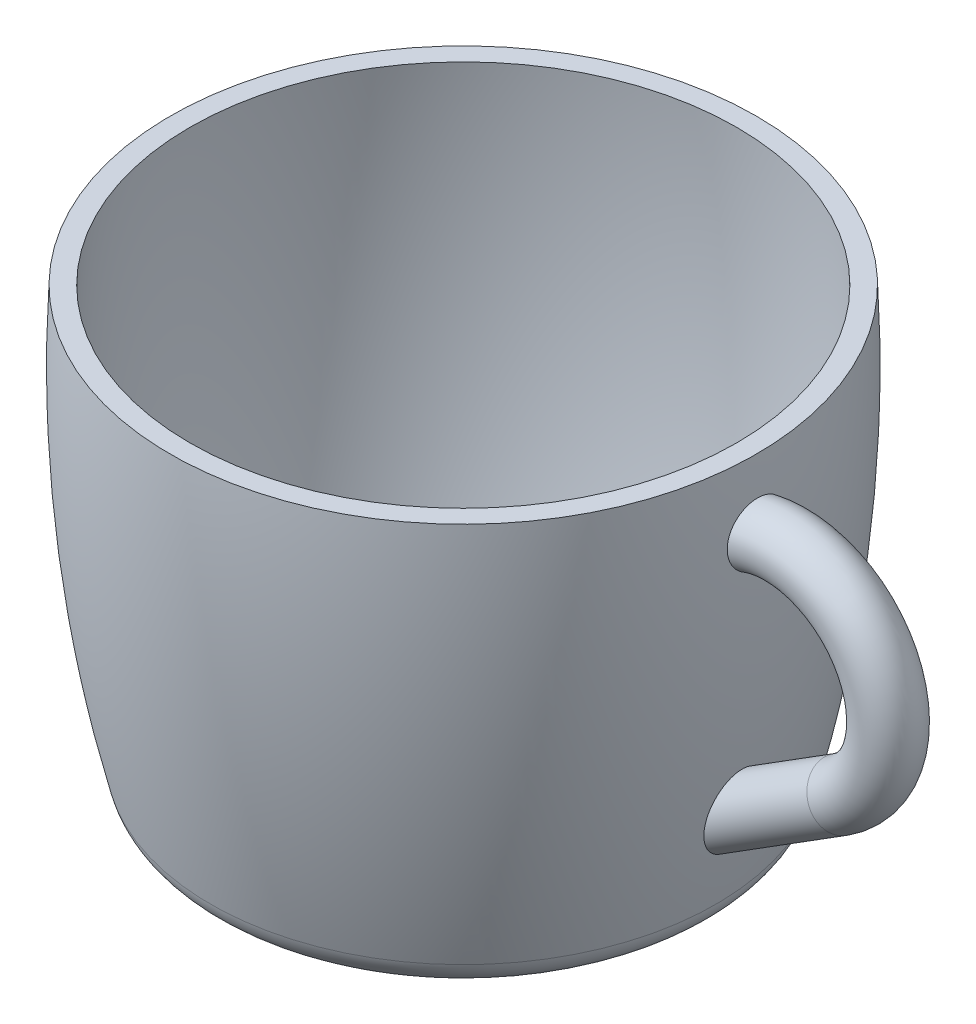
ISO-10303-21;
HEADER;
FILE_DESCRIPTION(('STEP AP214'),'2;1');
FILE_NAME('part.step','',(''),(''),'','','');
FILE_SCHEMA(('AUTOMOTIVE_DESIGN { 1 0 10303 214 1 1 1 1 }'));
ENDSEC;
DATA;
#1=APPLICATION_CONTEXT('core data for automotive mechanical design processes');
#2=APPLICATION_PROTOCOL_DEFINITION('international standard','automotive_design',2000,#1);
#3=PRODUCT_CONTEXT('',#1,'mechanical');
#4=PRODUCT('Part','Part','',(#3));
#5=PRODUCT_RELATED_PRODUCT_CATEGORY('part','',(#4));
#6=PRODUCT_DEFINITION_FORMATION('','',#4);
#7=PRODUCT_DEFINITION_CONTEXT('part definition',#1,'design');
#8=PRODUCT_DEFINITION('design','',#6,#7);
#9=PRODUCT_DEFINITION_SHAPE('','',#8);
#10=(LENGTH_UNIT() NAMED_UNIT(*) SI_UNIT(.MILLI.,.METRE.));
#11=(NAMED_UNIT(*) PLANE_ANGLE_UNIT() SI_UNIT($,.RADIAN.));
#12=(NAMED_UNIT(*) SI_UNIT($,.STERADIAN.) SOLID_ANGLE_UNIT());
#13=UNCERTAINTY_MEASURE_WITH_UNIT(LENGTH_MEASURE(1.E-05),#10,'distance_accuracy_value','');
#14=(GEOMETRIC_REPRESENTATION_CONTEXT(3) GLOBAL_UNCERTAINTY_ASSIGNED_CONTEXT((#13)) GLOBAL_UNIT_ASSIGNED_CONTEXT((#10,
#11,#12)) REPRESENTATION_CONTEXT('',''));
#15=CARTESIAN_POINT('',(0.,0.,0.));
#16=DIRECTION('',(0.,0.,1.));
#17=DIRECTION('',(1.,0.,0.));
#18=AXIS2_PLACEMENT_3D('',#15,#16,#17);
#19=CARTESIAN_POINT('',(0.,37.8307656430609,0.));
#20=DIRECTION('',(0.,-1.,0.));
#21=DIRECTION('',(0.,0.,-1.));
#22=AXIS2_PLACEMENT_3D('',#19,#20,#21);
#23=DEGENERATE_TOROIDAL_SURFACE('',#22,112.820173920687,141.,.F.);
#24=CARTESIAN_POINT('',(28.0939267680007,34.1727033823297,1.47013930084273));
#25=CARTESIAN_POINT('',(28.098052785009,34.0897917858126,1.35011754448564));
#26=CARTESIAN_POINT('',(28.1018780431306,34.0156310597502,1.22404886453937));
#27=CARTESIAN_POINT('',(28.1085712336181,33.88827607474,0.961668683807168));
#28=CARTESIAN_POINT('',(28.1114398524706,33.8350667760231,0.825364614389879));
#29=CARTESIAN_POINT('',(28.1159217040394,33.7526910965359,0.54469385159112));
#30=CARTESIAN_POINT('',(28.1175275539351,33.7236660518746,0.400284954708225));
#31=CARTESIAN_POINT('',(28.1192535818792,33.6924874031428,0.108583085184231));
#32=CARTESIAN_POINT('',(28.1193743576581,33.6903229878787,-0.0387087032054595));
#33=CARTESIAN_POINT('',(28.118162718884,33.7121854410131,-0.320590674050698));
#34=CARTESIAN_POINT('',(28.1169342198514,33.7343393449506,-0.455332332910221));
#35=CARTESIAN_POINT('',(28.1133229627621,33.800347507036,-0.719348492201702));
#36=CARTESIAN_POINT('',(28.1109398679948,33.844208095505,-0.848621385832717));
#37=CARTESIAN_POINT('',(28.1051746427437,33.95256341721,-1.10239452427035));
#38=CARTESIAN_POINT('',(28.1017664126068,34.0176014147798,-1.22665985435174));
#39=CARTESIAN_POINT('',(28.0942860185855,34.1647919716785,-1.46452181422794));
#40=CARTESIAN_POINT('',(28.0902135929775,34.2469512811505,-1.57811421047304));
#41=CARTESIAN_POINT('',(28.0810378576167,34.4398935670199,-1.81082533205163));
#42=CARTESIAN_POINT('',(28.0758742003077,34.5531557871295,-1.9278823600934));
#43=CARTESIAN_POINT('',(28.0655574744415,34.7949621418927,-2.14494266295726));
#44=CARTESIAN_POINT('',(28.0604044148207,34.9235160496807,-2.24493493098919));
#45=CARTESIAN_POINT('',(28.0496369057865,35.2175559450726,-2.44395286545056));
#46=CARTESIAN_POINT('',(28.0441128787931,35.3854788911991,-2.53939281982577));
#47=CARTESIAN_POINT('',(28.0343287997484,35.7336765425316,-2.70428507379648));
#48=CARTESIAN_POINT('',(28.0300694614008,35.9139581517581,-2.77372270521101));
#49=CARTESIAN_POINT('',(28.0229206613907,36.3049924770681,-2.89237098307851));
#50=CARTESIAN_POINT('',(28.020257639323,36.5168018053844,-2.93814338625935));
#51=CARTESIAN_POINT('',(28.0176464294867,36.9451195376369,-2.9945451591459));
#52=CARTESIAN_POINT('',(28.0176990094799,37.1616292531845,-3.00516458941149));
#53=CARTESIAN_POINT('',(28.0207347787654,37.598556610794,-2.98999756571531));
#54=CARTESIAN_POINT('',(28.0237871485375,37.8189457904785,-2.96334542102256));
#55=CARTESIAN_POINT('',(28.0327291726287,38.2515290372875,-2.87137363220633));
#56=CARTESIAN_POINT('',(28.0386183388775,38.4637245073572,-2.80606063923241));
#57=CARTESIAN_POINT('',(28.0522077666669,38.8610396900317,-2.6415823833145));
#58=CARTESIAN_POINT('',(28.0597915716997,39.047005172861,-2.54446039922764));
#59=CARTESIAN_POINT('',(28.0760092808761,39.3974587085022,-2.31707952503662));
#60=CARTESIAN_POINT('',(28.084642474135,39.561961146071,-2.18684300305985));
#61=CARTESIAN_POINT('',(28.1008920825619,39.8467511954677,-1.91078997665695));
#62=CARTESIAN_POINT('',(28.1085236447645,39.9698184112538,-1.7678454667739));
#63=CARTESIAN_POINT('',(28.1226649944415,40.1867048004043,-1.46120135185329));
#64=CARTESIAN_POINT('',(28.1291757289854,40.2805487214568,-1.29751947440192));
#65=CARTESIAN_POINT('',(28.1395494699285,40.425771791099,-0.973295250334292));
#66=CARTESIAN_POINT('',(28.1436223152708,40.4806394204729,-0.814318498216641));
#67=CARTESIAN_POINT('',(28.1496253625804,40.5605878100899,-0.489015627183516));
#68=CARTESIAN_POINT('',(28.1515567189566,40.5856846193509,-0.322693518251116));
#69=CARTESIAN_POINT('',(28.1529750945596,40.6041536270154,-0.000603220094096385));
#70=CARTESIAN_POINT('',(28.1526313208707,40.5997217711587,0.155042284543677));
#71=CARTESIAN_POINT('',(28.1499343044958,40.564454862817,0.463272514025585));
#72=CARTESIAN_POINT('',(28.1475813478776,40.533623569087,0.615857671437233));
#73=CARTESIAN_POINT('',(28.1411719506808,40.4474865049257,0.911599918048015));
#74=CARTESIAN_POINT('',(28.1371393027628,40.3925220120763,1.05485757254951));
#75=CARTESIAN_POINT('',(28.1277893677449,40.2603567201505,1.33064224769876));
#76=CARTESIAN_POINT('',(28.1224718994367,40.1831527841761,1.46316775118407));
#77=CARTESIAN_POINT('',(28.110806614877,40.005334256785,1.72024836154209));
#78=CARTESIAN_POINT('',(28.1044234174814,39.9038289748678,1.8441841991081));
#79=CARTESIAN_POINT('',(28.0914187903382,39.6829318190482,2.07487516915349));
#80=CARTESIAN_POINT('',(28.0847972873293,39.5635344083402,2.1816249620418));
#81=CARTESIAN_POINT('',(28.0713389578131,39.2995922995726,2.38461376007102));
#82=CARTESIAN_POINT('',(28.0645313812862,39.1537742775873,2.47919715403938));
#83=CARTESIAN_POINT('',(28.0519165751562,38.8494599057716,2.64513752840593));
#84=CARTESIAN_POINT('',(28.0461097425917,38.6909585602661,2.71648530016278));
#85=CARTESIAN_POINT('',(28.0354406420219,38.3488530459624,2.84144073547549));
#86=CARTESIAN_POINT('',(28.0307322323804,38.1643278421964,2.89254064711327));
#87=CARTESIAN_POINT('',(28.0234472824222,37.789618275909,2.96597975770292));
#88=CARTESIAN_POINT('',(28.0208715567231,37.5994317796617,2.98830796858752));
#89=CARTESIAN_POINT('',(28.0178456173619,37.200302657292,3.00537231376745));
#90=CARTESIAN_POINT('',(28.0176120911461,36.9912400903248,2.99738904774415));
#91=CARTESIAN_POINT('',(28.0197000073328,36.576953802115,2.94855975762674));
#92=CARTESIAN_POINT('',(28.022022682053,36.3717319809815,2.90769788565549));
#93=CARTESIAN_POINT('',(28.0290106699749,35.9587744093175,2.79097225101639));
#94=CARTESIAN_POINT('',(28.0338023061304,35.7515655426699,2.71324119146084));
#95=CARTESIAN_POINT('',(28.0450415537454,35.3533080446079,2.52365600276878));
#96=CARTESIAN_POINT('',(28.0514891890138,35.162259645591,2.41180138302064));
#97=CARTESIAN_POINT('',(28.0642054513427,34.8262007511277,2.17186999399173));
#98=CARTESIAN_POINT('',(28.0703926485373,34.6784251540009,2.04766274135799));
#99=CARTESIAN_POINT('',(28.0825358402672,34.4062987151891,1.7758213892254));
#100=CARTESIAN_POINT('',(28.0884921941365,34.2819102020208,1.62822568267714));
#101=CARTESIAN_POINT('',(28.0939267680007,34.1727033823297,1.47013930084273));
#102=B_SPLINE_CURVE_WITH_KNOTS('',3,(#24,#25,#26,#27,#28,#29,#30,#31,#32,#33,#34,#35,#36,#37,
#38,#39,#40,#41,#42,#43,#44,#45,#46,#47,#48,#49,#50,#51,#52,#53,#54,#55,#56,#57,#58,#59,#60,#61,
#62,#63,#64,#65,#66,#67,#68,#69,#70,#71,#72,#73,#74,#75,#76,#77,#78,#79,#80,#81,#82,#83,#84,#85,
#86,#87,#88,#89,#90,#91,#92,#93,#94,#95,#96,#97,#98,#99,#100,#101),.UNSPECIFIED.,.T.,.F.,(4,2,2,
2,2,2,2,2,2,2,2,2,2,2,2,2,2,2,2,2,2,2,2,2,2,2,2,2,2,2,2,2,2,2,2,2,2,2,4),(0.,0.437315068126776,
0.874315639265792,1.31385253660204,1.75321251802652,2.16096553402558,2.56883753318058,
2.9881275919722,3.4075832712943,3.89466590393428,4.3820615277039,4.95942813060181,
5.53711994311643,6.18430853943662,6.83168011154966,7.49434012908443,8.15688617678617,
8.78325338816589,9.40919862136106,9.9723745885283,10.5350723260745,11.0370777408897,
11.5388124086958,12.0036737647377,12.46846894477,12.9268929333193,13.385381614766,
13.864322949507,14.3434128021941,14.8630734359454,15.3829397694316,15.9551213691321,
16.5275214233623,17.1524367805021,17.7776535348121,18.4386096454126,19.0995752593602,
19.6765212495955,20.2525297912147),.UNSPECIFIED.);
#103=CARTESIAN_POINT('',(28.0304325626988,35.9118713990177,-2.767974069418));
#104=VERTEX_POINT('',#103);
#105=CARTESIAN_POINT('',(28.0304325626983,35.911871399041,2.76797406942635));
#106=VERTEX_POINT('',#105);
#107=EDGE_CURVE('E75',#104,#106,#102,.T.);
#108=ORIENTED_EDGE('',*,*,#107,.T.);
#109=CARTESIAN_POINT('',(28.0070333282441,35.9491244871741,3.00019999999999));
#110=CARTESIAN_POINT('',(28.0330529590178,35.9076995593251,2.75214754170766));
#111=CARTESIAN_POINT('',(28.0559046705138,35.8713181629792,2.50295157824496));
#112=CARTESIAN_POINT('',(28.0951556337756,35.8088281017147,2.00275956405343));
#113=CARTESIAN_POINT('',(28.1115545938962,35.782719901114,1.75176343248428));
#114=CARTESIAN_POINT('',(28.1506374088397,35.720497542801,1.00176864187458));
#115=CARTESIAN_POINT('',(28.1637202877461,35.6996687570481,0.50088432093729));
#116=CARTESIAN_POINT('',(28.1637202877461,35.6996687570481,-0.50088432093729));
#117=CARTESIAN_POINT('',(28.1506374088397,35.720497542801,-1.00176864187458));
#118=CARTESIAN_POINT('',(28.1115545938962,35.782719901114,-1.75176343248428));
#119=CARTESIAN_POINT('',(28.0951556337756,35.8088281017147,-2.00275956405343));
#120=CARTESIAN_POINT('',(28.0559046705138,35.8713181629792,-2.50295157824496));
#121=CARTESIAN_POINT('',(28.0330529590178,35.9076995593251,-2.75214754170766));
#122=CARTESIAN_POINT('',(28.0070333282441,35.9491244871741,-3.00019999999999));
#123=B_SPLINE_CURVE_WITH_KNOTS('',3,(#109,#110,#111,#112,#113,#114,#115,#116,#117,#118,#119,
#120,#121,#122),.UNSPECIFIED.,.F.,.F.,(4,2,2,2,2,2,4),(0.,0.758352851246727,1.5167399738516,
3.01865762847027,4.52057528308894,5.27896240569382,6.03731525694055),.UNSPECIFIED.);
#124=EDGE_CURVE('E12',#106,#104,#123,.T.);
#125=ORIENTED_EDGE('',*,*,#124,.T.);
#126=EDGE_LOOP('',(#108,#125));
#127=FACE_BOUND('',#126,.T.);
#128=CARTESIAN_POINT('',(0.,45.,0.));
#129=DIRECTION('',(0.,-1.,0.));
#130=DIRECTION('',(0.,0.,-1.));
#131=AXIS2_PLACEMENT_3D('',#128,#129,#130);
#132=CIRCLE('',#131,27.9974459950583);
#133=CARTESIAN_POINT('',(0.,45.,-27.9974459950583));
#134=VERTEX_POINT('',#133);
#135=EDGE_CURVE('E66',#134,#134,#132,.T.);
#136=ORIENTED_EDGE('',*,*,#135,.F.);
#137=EDGE_LOOP('',(#136));
#138=FACE_BOUND('',#137,.T.);
#139=CARTESIAN_POINT('',(0.,2.,0.));
#140=DIRECTION('',(0.,-1.,0.));
#141=DIRECTION('',(0.,0.,-1.));
#142=AXIS2_PLACEMENT_3D('',#139,#140,#141);
#143=CIRCLE('',#142,23.5512168965664);
#144=CARTESIAN_POINT('',(0.,2.,-23.5512168965664));
#145=VERTEX_POINT('',#144);
#146=EDGE_CURVE('E94',#145,#145,#143,.T.);
#147=ORIENTED_EDGE('',*,*,#146,.T.);
#148=EDGE_LOOP('',(#147));
#149=FACE_BOUND('',#148,.T.);
#150=CARTESIAN_POINT('',(24.7835634574592,7.20595740748011,-1.22536426161345));
#151=CARTESIAN_POINT('',(24.7897353243402,7.25091351130071,-1.30310748624831));
#152=CARTESIAN_POINT('',(24.7964928356563,7.29971868734505,-1.37854076006143));
#153=CARTESIAN_POINT('',(24.8111153032512,7.40414877273802,-1.52443460691802));
#154=CARTESIAN_POINT('',(24.8189807008391,7.45977639855619,-1.59489318149506));
#155=CARTESIAN_POINT('',(24.8441660350755,7.63575784667572,-1.79856453784336));
#156=CARTESIAN_POINT('',(24.8630613107079,7.76510792772971,-1.92390119170019));
#157=CARTESIAN_POINT('',(24.9089512963027,8.07086511573368,-2.17719788034686));
#158=CARTESIAN_POINT('',(24.9368139511292,8.25141048033068,-2.29992948042012));
#159=CARTESIAN_POINT('',(24.9970747352391,8.62932821823081,-2.51416973791422));
#160=CARTESIAN_POINT('',(25.0294772797599,8.82671689842954,-2.60564769841791));
#161=CARTESIAN_POINT('',(25.1081819211221,9.29158482245869,-2.78182782652284));
#162=CARTESIAN_POINT('',(25.155768055247,9.56259418313829,-2.85661115185101));
#163=CARTESIAN_POINT('',(25.255827947272,10.1122438281892,-2.96074428545699));
#164=CARTESIAN_POINT('',(25.3083065606176,10.3908914952637,-2.99004843887897));
#165=CARTESIAN_POINT('',(25.4175212548461,10.9528131865811,-3.00580439556163));
#166=CARTESIAN_POINT('',(25.4743091580036,11.2360942306923,-2.99161059568834));
#167=CARTESIAN_POINT('',(25.5898371672059,11.7967322259055,-2.91978098127463));
#168=CARTESIAN_POINT('',(25.648576949867,12.0740901459551,-2.86215232897793));
#169=CARTESIAN_POINT('',(25.7588362752491,12.5827219922376,-2.71210763348436));
#170=CARTESIAN_POINT('',(25.8103637687823,12.8154941090035,-2.62478401259494));
#171=CARTESIAN_POINT('',(25.9114910652597,13.2644517321364,-2.4137079150884));
#172=CARTESIAN_POINT('',(25.961093628412,13.4806614567852,-2.29000995983546));
#173=CARTESIAN_POINT('',(26.0414722242134,13.8261254229351,-2.04616812484048));
#174=CARTESIAN_POINT('',(26.0734546060488,13.9620958142943,-1.93594379923149));
#175=CARTESIAN_POINT('',(26.1336476497055,14.2158928609021,-1.69531486538824));
#176=CARTESIAN_POINT('',(26.161864025899,14.3337470470826,-1.56494149438104));
#177=CARTESIAN_POINT('',(26.2070860168529,14.5214453462153,-1.3149704421046));
#178=CARTESIAN_POINT('',(26.2251942107958,14.5961534756933,-1.19923675324007));
#179=CARTESIAN_POINT('',(26.2568571190149,14.7263103202304,-0.956632919918842));
#180=CARTESIAN_POINT('',(26.2704147524546,14.7817713829717,-0.829769980971242));
#181=CARTESIAN_POINT('',(26.2865543442774,14.8476543020429,-0.632767036601696));
#182=CARTESIAN_POINT('',(26.2912475846344,14.8667823558741,-0.565625829632881));
#183=CARTESIAN_POINT('',(26.2990821506068,14.8986874705335,-0.42977513504264));
#184=CARTESIAN_POINT('',(26.3022242774967,14.9114678104861,-0.361066476368556));
#185=CARTESIAN_POINT('',(26.3068702012107,14.9303575952696,-0.222707143599863));
#186=CARTESIAN_POINT('',(26.3083746720037,14.9364697843455,-0.15305686897945));
#187=CARTESIAN_POINT('',(26.3097082076136,14.9418874084261,-0.0135000657537701));
#188=CARTESIAN_POINT('',(26.309537489091,14.9411937236674,0.0564064285443192));
#189=CARTESIAN_POINT('',(26.3067875495076,14.9300216459609,0.246139130470127));
#190=CARTESIAN_POINT('',(26.3025603162346,14.9128481564384,0.365611814514044));
#191=CARTESIAN_POINT('',(26.2894685539272,14.8595406201769,0.599872100590364));
#192=CARTESIAN_POINT('',(26.2806032763081,14.8234035126892,0.714658943098492));
#193=CARTESIAN_POINT('',(26.2586838626019,14.7337495652175,0.93906313248338));
#194=CARTESIAN_POINT('',(26.2455597979253,14.679942395085,1.04855642250452));
#195=CARTESIAN_POINT('',(26.2159473968607,14.5579944934387,1.258671780637));
#196=CARTESIAN_POINT('',(26.1994574770988,14.4898470154537,1.35928964152559));
#197=CARTESIAN_POINT('',(26.1541191167035,14.3014715485837,1.60339434359392));
#198=CARTESIAN_POINT('',(26.1234386272627,14.1731226423284,1.74029428969043));
#199=CARTESIAN_POINT('',(26.0580323133078,13.8966579712194,1.99133540888438));
#200=CARTESIAN_POINT('',(26.023295934359,13.7484904809554,2.10541500888989));
#201=CARTESIAN_POINT('',(25.9374911471345,13.3780780329621,2.3517973701226));
#202=CARTESIAN_POINT('',(25.8853080560046,13.1493689966117,2.47404447863557));
#203=CARTESIAN_POINT('',(25.8058908508076,12.7944106837763,2.62808270738572));
#204=CARTESIAN_POINT('',(25.779208513227,12.6740183474453,2.67456278502007));
#205=CARTESIAN_POINT('',(25.725688822051,12.430024395153,2.75807729806242));
#206=CARTESIAN_POINT('',(25.6988514843203,12.3064231032649,2.79511268323512));
#207=CARTESIAN_POINT('',(25.6170821438953,11.9256028459992,2.89403997108469));
#208=CARTESIAN_POINT('',(25.5622525519776,11.6644165478559,2.94117416234078));
#209=CARTESIAN_POINT('',(25.4544733987233,11.1374182076641,2.99731110009378));
#210=CARTESIAN_POINT('',(25.4015254775844,10.871602417021,3.00628135128362));
#211=CARTESIAN_POINT('',(25.3200816050619,10.45060084302,2.989514245398));
#212=CARTESIAN_POINT('',(25.2905153828713,10.2950485226607,2.9765770030042));
#213=CARTESIAN_POINT('',(25.2327393110148,9.98547861734672,2.93683994103663));
#214=CARTESIAN_POINT('',(25.2045298364801,9.83146146608128,2.91003631131575));
#215=CARTESIAN_POINT('',(25.1224016837106,9.3741456260946,2.80804168036002));
#216=CARTESIAN_POINT('',(25.0708024394677,9.07464800965052,2.71123697112653));
#217=CARTESIAN_POINT('',(24.9934094018277,8.60662193413656,2.50147219783408));
#218=CARTESIAN_POINT('',(24.9650486632569,8.43002546421978,2.40714167354697));
#219=CARTESIAN_POINT('',(24.9124000541971,8.09333891390904,2.19163518952993));
#220=CARTESIAN_POINT('',(24.8881051971428,7.93322070448513,2.07050612826709));
#221=CARTESIAN_POINT('',(24.8485553182027,7.66594395369822,1.82746402465734));
#222=CARTESIAN_POINT('',(24.8324616770747,7.55455390757345,1.71034553408123));
#223=CARTESIAN_POINT('',(24.8037117822551,7.35195362962826,1.45909460191193));
#224=CARTESIAN_POINT('',(24.7910547784156,7.26073899473427,1.32496588269744));
#225=CARTESIAN_POINT('',(24.7749107225153,7.14276411489922,1.1123487158389));
#226=CARTESIAN_POINT('',(24.7699850574341,7.10644289557584,1.03916555504578));
#227=CARTESIAN_POINT('',(24.761158745191,7.04095341567843,0.88962306167808));
#228=CARTESIAN_POINT('',(24.7572575346605,7.01178122429842,0.813265501645786));
#229=CARTESIAN_POINT('',(24.7505224068012,6.96118257439808,0.658020229378551));
#230=CARTESIAN_POINT('',(24.747687848678,6.93975146571209,0.579134067221633));
#231=CARTESIAN_POINT('',(24.7431143230204,6.90506880352728,0.419584031883727));
#232=CARTESIAN_POINT('',(24.7413751449464,6.89181567817276,0.338920503411708));
#233=CARTESIAN_POINT('',(24.7381919391776,6.86754413526838,0.119985988727016));
#234=CARTESIAN_POINT('',(24.7377972562979,6.8645120238111,-0.0192761950347188));
#235=CARTESIAN_POINT('',(24.7402493302218,6.88323660229048,-0.295962614470884));
#236=CARTESIAN_POINT('',(24.7430945253731,6.90498134954649,-0.433387703351221));
#237=CARTESIAN_POINT('',(24.751288272686,6.96696532252839,-0.68313956987332));
#238=CARTESIAN_POINT('',(24.7562238401717,7.00413884710504,-0.796258689711158));
#239=CARTESIAN_POINT('',(24.7682869534432,7.09395626469869,-1.01604936721285));
#240=CARTESIAN_POINT('',(24.775414762722,7.14660201734076,-1.12272014798413));
#241=CARTESIAN_POINT('',(24.7835634574592,7.20595740748011,-1.22536426161345));
#242=B_SPLINE_CURVE_WITH_KNOTS('',3,(#150,#151,#152,#153,#154,#155,#156,#157,#158,#159,#160,
#161,#162,#163,#164,#165,#166,#167,#168,#169,#170,#171,#172,#173,#174,#175,#176,#177,#178,#179,
#180,#181,#182,#183,#184,#185,#186,#187,#188,#189,#190,#191,#192,#193,#194,#195,#196,#197,#198,
#199,#200,#201,#202,#203,#204,#205,#206,#207,#208,#209,#210,#211,#212,#213,#214,#215,#216,#217,
#218,#219,#220,#221,#222,#223,#224,#225,#226,#227,#228,#229,#230,#231,#232,#233,#234,#235,#236,
#237,#238,#239,#240,#241),.UNSPECIFIED.,.T.,.F.,(4,2,2,2,2,2,2,2,2,2,2,2,2,2,2,2,2,2,2,2,2,2,2,
2,2,2,2,2,2,2,2,2,2,2,2,2,2,2,2,2,2,2,2,2,2,4),(0.,0.269890496642309,0.539888805598566,
1.08047756540378,1.73727998962444,2.39472567444886,3.24567489475754,4.09747780018284,
4.9619842046066,5.82634808635701,6.58542566342417,7.34337121142432,7.87551601584281,
8.40684395775969,8.82214390631265,9.23717693041097,9.44681647224756,9.65634760482197,
9.86579247331514,10.0752102536447,10.4356403710257,10.7961286801237,11.1628640817837,
11.5297724032689,12.0969993291447,12.6657366751278,13.4547573131081,13.8498335845099,
14.2448701110926,15.0548856045953,15.8655906610959,16.3415957141723,16.817731631424,
17.7671843683783,18.3718837692677,18.975533178163,19.461022516329,19.9464057967273,
20.1916355595038,20.4367301816196,20.681677326494,20.9265773764337,21.3420571581732,
21.7573367594076,22.1136294184343,22.469964918215),.UNSPECIFIED.);
#243=CARTESIAN_POINT('',(24.7835634574592,7.20595740748011,-1.22536426161345));
#244=VERTEX_POINT('',#243);
#245=EDGE_CURVE('E97',#244,#244,#242,.T.);
#246=ORIENTED_EDGE('',*,*,#245,.T.);
#247=EDGE_LOOP('',(#246));
#248=FACE_BOUND('',#247,.T.);
#249=ADVANCED_FACE('F53',(#127,#138,#149,#248),#23,.T.);
#250=CARTESIAN_POINT('',(0.,37.8307656430609,0.));
#251=DIRECTION('',(0.,-1.,0.));
#252=DIRECTION('',(0.,0.,-1.));
#253=AXIS2_PLACEMENT_3D('',#250,#251,#252);
#254=DEGENERATE_TOROIDAL_SURFACE('',#253,112.820173920687,143.,.F.);
#255=CARTESIAN_POINT('',(30.148964678511,34.9590270662238,-0.349286779302632));
#256=CARTESIAN_POINT('',(30.1504240771959,34.9393325801504,-0.189035241934723));
#257=CARTESIAN_POINT('',(30.1508860757869,34.9332018030774,-0.0269985980729917));
#258=CARTESIAN_POINT('',(30.1497552570539,34.948375549478,0.295886695866048));
#259=CARTESIAN_POINT('',(30.1481603331543,34.9697081992925,0.456733958081047));
#260=CARTESIAN_POINT('',(30.1430948928835,35.0389893372449,0.772364753373063));
#261=CARTESIAN_POINT('',(30.1396264850008,35.0869079062424,0.927154893735637));
#262=CARTESIAN_POINT('',(30.1311927896185,35.2076025583213,1.22661905842176));
#263=CARTESIAN_POINT('',(30.1262276646779,35.2803759420249,1.37129417924068));
#264=CARTESIAN_POINT('',(30.1152356308331,35.4496652496295,1.649060990617));
#265=CARTESIAN_POINT('',(30.1091933635327,35.5465339151955,1.78193672041783));
#266=CARTESIAN_POINT('',(30.0967268783586,35.760367886813,2.0303576287457));
#267=CARTESIAN_POINT('',(30.0903025871177,35.8773370613492,2.14589946320994));
#268=CARTESIAN_POINT('',(30.0774446414617,36.13332204228,2.36156442732785));
#269=CARTESIAN_POINT('',(30.0710220339302,36.2730599445603,2.46083106118398));
#270=CARTESIAN_POINT('',(30.0591207676467,36.5667292492832,2.63556747104805));
#271=CARTESIAN_POINT('',(30.0536423010843,36.7206635317775,2.71103240456528));
#272=CARTESIAN_POINT('',(30.0439899596305,37.0449446182578,2.839069986763));
#273=CARTESIAN_POINT('',(30.0398767206224,37.215700886162,2.89061140155084));
#274=CARTESIAN_POINT('',(30.033695001553,37.5633818046249,2.96509048567355));
#275=CARTESIAN_POINT('',(30.031626817463,37.7403073441987,2.98802401484849));
#276=CARTESIAN_POINT('',(30.0297181172077,38.0996490261359,3.00495007803884));
#277=CARTESIAN_POINT('',(30.0299299732776,38.2820978110409,2.99826429749174));
#278=CARTESIAN_POINT('',(30.0326637424913,38.6433092192375,2.95449365102937));
#279=CARTESIAN_POINT('',(30.0351857790747,38.8220716450343,2.91740716072655));
#280=CARTESIAN_POINT('',(30.0422348184158,39.1709414510348,2.81356129602882));
#281=CARTESIAN_POINT('',(30.0467638932966,39.341039683194,2.74677125459139));
#282=CARTESIAN_POINT('',(30.0572784633269,39.6672479904925,2.58503001594061));
#283=CARTESIAN_POINT('',(30.063263841657,39.8233591862477,2.49008107739856));
#284=CARTESIAN_POINT('',(30.0758180351293,40.1135209201332,2.27663635325606));
#285=CARTESIAN_POINT('',(30.0823720125961,40.2479648821295,2.15867514079727));
#286=CARTESIAN_POINT('',(30.095364307238,40.4941948113078,1.90107082528565));
#287=CARTESIAN_POINT('',(30.1018026486966,40.6059855875929,1.76143233529789));
#288=CARTESIAN_POINT('',(30.1135293709232,40.7993217946821,1.46988151992198));
#289=CARTESIAN_POINT('',(30.1188512166703,40.8818244859684,1.31860550294981));
#290=CARTESIAN_POINT('',(30.1279810318531,41.019168263764,1.00393500429715));
#291=CARTESIAN_POINT('',(30.131789370371,41.0740160950363,0.840543488635811));
#292=CARTESIAN_POINT('',(30.1373117267433,41.1525206130435,0.512812229544358));
#293=CARTESIAN_POINT('',(30.1390981283828,41.1772578952217,0.348732027815697));
#294=CARTESIAN_POINT('',(30.1406149918761,41.1983019132961,0.018757566687346));
#295=CARTESIAN_POINT('',(30.1403457446505,41.1946126721842,-0.147136432700943));
#296=CARTESIAN_POINT('',(30.1378092150669,41.1592950688984,-0.472626256905834));
#297=CARTESIAN_POINT('',(30.1355808262117,41.1282105376263,-0.632281828317078));
#298=CARTESIAN_POINT('',(30.1294330257674,41.03992382998,-0.944152385184787));
#299=CARTESIAN_POINT('',(30.1255136026285,40.9827214752191,-1.09636731981333));
#300=CARTESIAN_POINT('',(30.1163861825338,40.8435806532222,-1.39036984328353));
#301=CARTESIAN_POINT('',(30.111168780364,40.7614606326605,-1.53207106393407));
#302=CARTESIAN_POINT('',(30.1000334646429,40.5752573178328,-1.80017494579406));
#303=CARTESIAN_POINT('',(30.0941154636355,40.4711712802695,-1.92657569304873));
#304=CARTESIAN_POINT('',(30.0820306703049,40.2407517275229,-2.16457942067684));
#305=CARTESIAN_POINT('',(30.0758617131984,40.1138486345886,-2.27563052019032));
#306=CARTESIAN_POINT('',(30.0641190889432,39.8437639675214,-2.47578778722712));
#307=CARTESIAN_POINT('',(30.0585455287829,39.7005794772548,-2.56489001444712));
#308=CARTESIAN_POINT('',(30.0483942570812,39.3961622552209,-2.7221929533534));
#309=CARTESIAN_POINT('',(30.0438625334693,39.2344499574437,-2.78946884383331));
#310=CARTESIAN_POINT('',(30.0365832906609,38.902216721674,-2.89689977660787));
#311=CARTESIAN_POINT('',(30.033836080529,38.7316942633442,-2.93705012100507));
#312=CARTESIAN_POINT('',(30.0303827981238,38.3810156615528,-2.99024166472487));
#313=CARTESIAN_POINT('',(30.0297427994302,38.2007248139689,-3.00240177818768));
#314=CARTESIAN_POINT('',(30.0307815852721,37.840604980997,-2.99681287310094));
#315=CARTESIAN_POINT('',(30.0324606172369,37.6607760469438,-2.97906066300612));
#316=CARTESIAN_POINT('',(30.0380101963833,37.3041567172323,-2.91362428986091));
#317=CARTESIAN_POINT('',(30.041909980259,37.1274399584709,-2.86553986756055));
#318=CARTESIAN_POINT('',(30.0514969442489,36.784714391999,-2.7401895244134));
#319=CARTESIAN_POINT('',(30.0571840766815,36.6187052987794,-2.66292438201817));
#320=CARTESIAN_POINT('',(30.0696445934705,36.3038461754856,-2.48187276584844));
#321=CARTESIAN_POINT('',(30.0764077760521,36.1548555798489,-2.37833041706124));
#322=CARTESIAN_POINT('',(30.0902756079504,35.8770628579793,-2.14691831384787));
#323=CARTESIAN_POINT('',(30.0973802926421,35.7482628291306,-2.01904603509306));
#324=CARTESIAN_POINT('',(30.1108612171083,35.5189787390187,-1.74670725790605));
#325=CARTESIAN_POINT('',(30.1172531419992,35.4177455152009,-1.60287222485534));
#326=CARTESIAN_POINT('',(30.1287830763972,35.2422868550094,-1.29969234541772));
#327=CARTESIAN_POINT('',(30.1339230359996,35.1680193264289,-1.140372167803));
#328=CARTESIAN_POINT('',(30.1407055951715,35.0721735075262,-0.874573566950822));
#329=CARTESIAN_POINT('',(30.1429328231904,35.0413180150153,-0.771363972810329));
#330=CARTESIAN_POINT('',(30.1465759602881,34.9913088032276,-0.562129496782955));
#331=CARTESIAN_POINT('',(30.147991895692,34.9721547042571,-0.456104706361732));
#332=CARTESIAN_POINT('',(30.148964678511,34.9590270662238,-0.349286779302632));
#333=B_SPLINE_CURVE_WITH_KNOTS('',3,(#255,#256,#257,#258,#259,#260,#261,#262,#263,#264,#265,
#266,#267,#268,#269,#270,#271,#272,#273,#274,#275,#276,#277,#278,#279,#280,#281,#282,#283,#284,
#285,#286,#287,#288,#289,#290,#291,#292,#293,#294,#295,#296,#297,#298,#299,#300,#301,#302,#303,
#304,#305,#306,#307,#308,#309,#310,#311,#312,#313,#314,#315,#316,#317,#318,#319,#320,#321,#322,
#323,#324,#325,#326,#327,#328,#329,#330,#331,#332),.UNSPECIFIED.,.T.,.F.,(4,2,2,2,2,2,2,2,2,2,2,
2,2,2,2,2,2,2,2,2,2,2,2,2,2,2,2,2,2,2,2,2,2,2,2,2,2,2,4),(0.,0.483993944805112,
0.968483960776741,1.45242984629713,1.93632318917746,2.42776680446927,2.91930510769818,
3.43158759536619,3.94397424052411,4.47676418335235,5.00963122309672,5.55476379463152,
6.09992549589053,6.64565135358941,7.19133344955649,7.72559156740181,8.25973614712146,
8.77433027766487,9.28879884270784,9.78420154355582,10.2795341350731,10.7652498048918,
11.2509687922313,11.7403154192315,12.2297231960754,12.7336859143088,13.2377390390617,
13.7609807823257,14.2843131230778,14.8239062091548,15.363556871662,15.910482066972,
16.4573926730364,16.9993972592867,17.5414581114005,18.0668443451667,18.5914069132615,
18.9140303866657,19.2366433908364),.UNSPECIFIED.);
#334=CARTESIAN_POINT('',(30.148964678511,34.9590270662238,-0.349286779302632));
#335=VERTEX_POINT('',#334);
#336=EDGE_CURVE('E79',#335,#335,#333,.T.);
#337=ORIENTED_EDGE('',*,*,#336,.T.);
#338=EDGE_LOOP('',(#337));
#339=FACE_BOUND('',#338,.T.);
#340=CARTESIAN_POINT('',(0.,45.,0.));
#341=DIRECTION('',(0.,-1.,0.));
#342=DIRECTION('',(0.,0.,-1.));
#343=AXIS2_PLACEMENT_3D('',#340,#341,#342);
#344=CIRCLE('',#343,30.);
#345=CARTESIAN_POINT('',(0.,45.,-30.));
#346=VERTEX_POINT('',#345);
#347=EDGE_CURVE('E147',#346,#346,#344,.T.);
#348=ORIENTED_EDGE('',*,*,#347,.T.);
#349=EDGE_LOOP('',(#348));
#350=FACE_BOUND('',#349,.T.);
#351=CARTESIAN_POINT('',(0.,3.02645278725004,0.));
#352=DIRECTION('',(0.,-1.,0.));
#353=DIRECTION('',(0.,0.,-1.));
#354=AXIS2_PLACEMENT_3D('',#351,#352,#353);
#355=CIRCLE('',#354,25.8797172351277);
#356=CARTESIAN_POINT('',(0.,3.02645278725004,-25.8797172351277));
#357=VERTEX_POINT('',#356);
#358=EDGE_CURVE('E149',#357,#357,#355,.T.);
#359=ORIENTED_EDGE('',*,*,#358,.F.);
#360=EDGE_LOOP('',(#359));
#361=FACE_BOUND('',#360,.T.);
#362=CARTESIAN_POINT('',(27.1350010712613,8.55927490101033,-0.957638140288263));
#363=CARTESIAN_POINT('',(27.1282361052558,8.50627758144388,-0.835064799093473));
#364=CARTESIAN_POINT('',(27.1227578021091,8.46281107256626,-0.708120442410549));
#365=CARTESIAN_POINT('',(27.1145550541512,8.39743181194824,-0.448578461838393));
#366=CARTESIAN_POINT('',(27.1118334911686,8.37554161619942,-0.315975072682958));
#367=CARTESIAN_POINT('',(27.1092406829894,8.35469172310478,-0.0487479278530565));
#368=CARTESIAN_POINT('',(27.1093729616384,8.35576037471029,0.0858781204587859));
#369=CARTESIAN_POINT('',(27.1124928935603,8.38083815955123,0.352888550933983));
#370=CARTESIAN_POINT('',(27.115479992598,8.40484283998307,0.485273363134236));
#371=CARTESIAN_POINT('',(27.124127952288,8.47368254538489,0.741786854277925));
#372=CARTESIAN_POINT('',(27.1297395803885,8.51813377783916,0.866021422561617));
#373=CARTESIAN_POINT('',(27.1434546743912,8.62540345821946,1.10609099697438));
#374=CARTESIAN_POINT('',(27.1515588027797,8.68822678908175,1.22192375984397));
#375=CARTESIAN_POINT('',(27.1709011394176,8.83589403273009,1.45337498217782));
#376=CARTESIAN_POINT('',(27.1823563836522,8.92221484218365,1.56802818204291));
#377=CARTESIAN_POINT('',(27.2077293166253,9.10987013390775,1.78393402457741));
#378=CARTESIAN_POINT('',(27.2216485977672,9.21121431822547,1.88517792696498));
#379=CARTESIAN_POINT('',(27.2588941189918,9.47706238656789,2.11897153576977));
#380=CARTESIAN_POINT('',(27.2835363256407,9.64859912140121,2.24334899735386));
#381=CARTESIAN_POINT('',(27.3369215576777,10.0091375049814,2.46244831481111));
#382=CARTESIAN_POINT('',(27.3656732434359,10.1981757324777,2.55710615720895));
#383=CARTESIAN_POINT('',(27.4354185776383,10.6435936521073,2.74139287019725));
#384=CARTESIAN_POINT('',(27.4775499345455,10.9036573951689,2.821678179748));
#385=CARTESIAN_POINT('',(27.5662368828087,11.4325212612983,2.93851796009296));
#386=CARTESIAN_POINT('',(27.6127955137325,11.7013273019006,2.97504214904822));
#387=CARTESIAN_POINT('',(27.7098308998851,12.2446738535778,3.00695726675429));
#388=CARTESIAN_POINT('',(27.7603550475128,12.5192406958836,3.00173801195746));
#389=CARTESIAN_POINT('',(27.863374505223,13.0640786286093,2.94968890519463));
#390=CARTESIAN_POINT('',(27.9158698899431,13.3343495558186,2.9028574761243));
#391=CARTESIAN_POINT('',(28.017407391483,13.8450453408253,2.7718430170679));
#392=CARTESIAN_POINT('',(28.0664272087607,14.0862206721498,2.69057913166693));
#393=CARTESIAN_POINT('',(28.1629789478751,14.5525287011859,2.4898143135226));
#394=CARTESIAN_POINT('',(28.2105127667235,14.7776823636968,2.37036451641137));
#395=CARTESIAN_POINT('',(28.2882521542001,15.140389135602,2.13130003814659));
#396=CARTESIAN_POINT('',(28.3194811745333,15.2843935722709,2.02180698652199));
#397=CARTESIAN_POINT('',(28.3785034163432,15.5541116083985,1.78136948584072));
#398=CARTESIAN_POINT('',(28.4063019371715,15.6798534739764,1.65045886864683));
#399=CARTESIAN_POINT('',(28.4511295893828,15.8812183399116,1.39843083292216));
#400=CARTESIAN_POINT('',(28.4691836734897,15.9617856122395,1.2814573703629));
#401=CARTESIAN_POINT('',(28.5010386181375,16.103360785934,1.0354707248716));
#402=CARTESIAN_POINT('',(28.5148419319928,16.1643799702203,0.906464542803539));
#403=CARTESIAN_POINT('',(28.5315817675402,16.238195859651,0.705489357253689));
#404=CARTESIAN_POINT('',(28.5365160142867,16.2599150367106,0.636875963458871));
#405=CARTESIAN_POINT('',(28.5449042978838,16.2968016948593,0.497835406594942));
#406=CARTESIAN_POINT('',(28.5483591191805,16.3119726480934,0.42740922578664));
#407=CARTESIAN_POINT('',(28.5536943587739,16.3353887270809,0.285386531224999));
#408=CARTESIAN_POINT('',(28.5555755801724,16.3436373857003,0.213790633493391));
#409=CARTESIAN_POINT('',(28.5577161688861,16.3530221982755,0.0701354711653776));
#410=CARTESIAN_POINT('',(28.5579757723767,16.3541593879592,-0.00192372442509092));
#411=CARTESIAN_POINT('',(28.5564602057569,16.3475170516242,-0.196910626970114));
#412=CARTESIAN_POINT('',(28.553110854878,16.3328394235442,-0.319659344254667));
#413=CARTESIAN_POINT('',(28.5418937315116,16.2835747241399,-0.560767313340633));
#414=CARTESIAN_POINT('',(28.5340254411323,16.2489853708375,-0.67912606037543));
#415=CARTESIAN_POINT('',(28.5143298381056,16.1621051850098,-0.909037383214235));
#416=CARTESIAN_POINT('',(28.5024936567944,16.1097746961495,-1.02057404463868));
#417=CARTESIAN_POINT('',(28.4755744049233,15.9902277034265,-1.23486008257681));
#418=CARTESIAN_POINT('',(28.4604898731896,15.9230045001263,-1.33760547544138));
#419=CARTESIAN_POINT('',(28.4194564699305,15.7391516654387,-1.58323063212533));
#420=CARTESIAN_POINT('',(28.3918773796378,15.614754908356,-1.72004015137192));
#421=CARTESIAN_POINT('',(28.3328977619265,15.3460036042819,-1.97151549451849));
#422=CARTESIAN_POINT('',(28.3014877831541,15.2015995721577,-2.08612466939638));
#423=CARTESIAN_POINT('',(28.2243565187226,14.8427991586153,-2.33217307637998));
#424=CARTESIAN_POINT('',(28.1776258141551,14.6222156946859,-2.45425829632569));
#425=CARTESIAN_POINT('',(28.0825182307688,14.1646961323904,-2.66081273265958));
#426=CARTESIAN_POINT('',(28.0341402307517,13.927748778746,-2.74525575462057));
#427=CARTESIAN_POINT('',(27.9363128109002,13.438212266253,-2.880063411066));
#428=CARTESIAN_POINT('',(27.8868660110033,13.1853826424289,-2.92954743763079));
#429=CARTESIAN_POINT('',(27.7894405561437,12.6747461916274,-2.99179404784226));
#430=CARTESIAN_POINT('',(27.7414629556766,12.4169359967814,-3.00453084084704));
#431=CARTESIAN_POINT('',(27.6673565136184,12.0076338186943,-2.9950778098518));
#432=CARTESIAN_POINT('',(27.6403439364758,11.8559446476685,-2.9850797271218));
#433=CARTESIAN_POINT('',(27.5874580683869,11.5538345010365,-2.95179303165398));
#434=CARTESIAN_POINT('',(27.561585063512,11.4034138514482,-2.92850110196359));
#435=CARTESIAN_POINT('',(27.4860686119352,10.9562498935623,-2.83803579731759));
#436=CARTESIAN_POINT('',(27.438386263532,10.6628234118812,-2.75025977813148));
#437=CARTESIAN_POINT('',(27.3648437819383,10.1926814661895,-2.55419045404104));
#438=CARTESIAN_POINT('',(27.3369707227098,10.0093719737766,-2.46219243191552));
#439=CARTESIAN_POINT('',(27.2850654354259,9.65901980897493,-2.25006640288417));
#440=CARTESIAN_POINT('',(27.2610290489013,9.49195960222239,-2.12996920503165));
#441=CARTESIAN_POINT('',(27.2219565165179,9.21365132298551,-1.88878269584027));
#442=CARTESIAN_POINT('',(27.2060852582388,9.09797960598976,-1.77293248849807));
#443=CARTESIAN_POINT('',(27.1776165554405,8.88682457837757,-1.52397767029535));
#444=CARTESIAN_POINT('',(27.1650089232722,8.79127862204362,-1.39092874518009));
#445=CARTESIAN_POINT('',(27.1506049767859,8.68060354745718,-1.20327501891776));
#446=CARTESIAN_POINT('',(27.147189170479,8.65420793204698,-1.15525347318592));
#447=CARTESIAN_POINT('',(27.1407767262573,8.60442921069569,-1.05761381429763));
#448=CARTESIAN_POINT('',(27.1377803168714,8.58104774770731,-1.00799484868037));
#449=CARTESIAN_POINT('',(27.1350010712613,8.55927490101033,-0.957638140288263));
#450=B_SPLINE_CURVE_WITH_KNOTS('',3,(#362,#363,#364,#365,#366,#367,#368,#369,#370,#371,#372,
#373,#374,#375,#376,#377,#378,#379,#380,#381,#382,#383,#384,#385,#386,#387,#388,#389,#390,#391,
#392,#393,#394,#395,#396,#397,#398,#399,#400,#401,#402,#403,#404,#405,#406,#407,#408,#409,#410,
#411,#412,#413,#414,#415,#416,#417,#418,#419,#420,#421,#422,#423,#424,#425,#426,#427,#428,#429,
#430,#431,#432,#433,#434,#435,#436,#437,#438,#439,#440,#441,#442,#443,#444,#445,#446,#447,#448,
#449),.UNSPECIFIED.,.T.,.F.,(4,2,2,2,2,2,2,2,2,2,2,2,2,2,2,2,2,2,2,2,2,2,2,2,2,2,2,2,2,2,2,2,2,
2,2,2,2,2,2,2,2,2,2,4),(0.,0.400938681245319,0.802296062756557,1.20414905774148,
1.60592405278277,2.00044730522547,2.39507550950249,2.82536472153023,3.25593303336512,
3.89233803032222,4.53010453089665,5.35201756028767,6.17449900953623,7.00902479122322,
7.84358220284539,8.61829655343893,9.39197778166407,9.94097877930739,10.4891207855469,
10.9171037534044,11.3448392477422,11.5609711734777,11.7769883557265,11.9928952241691,
12.2087706467917,12.5777941439338,12.9468599413426,13.31675620233,13.6868191990059,
14.2445490204355,14.8036837864348,15.5688006004372,16.3344490154076,17.1187556240892,
17.9036125559957,18.3662650237051,18.8290329784956,19.7522177504455,20.3711545594231,
20.989415895632,21.4810736032899,21.9711775360193,22.1358054966574,22.300522816572),.UNSPECIFIED.);
#451=CARTESIAN_POINT('',(27.1350010712613,8.55927490101033,-0.957638140288263));
#452=VERTEX_POINT('',#451);
#453=EDGE_CURVE('E78',#452,#452,#450,.T.);
#454=ORIENTED_EDGE('',*,*,#453,.T.);
#455=EDGE_LOOP('',(#454));
#456=FACE_BOUND('',#455,.T.);
#457=ADVANCED_FACE('F87',(#339,#350,#361,#456),#254,.F.);
#458=CARTESIAN_POINT('',(0.,45.,0.));
#459=DIRECTION('',(0.,1.,0.));
#460=DIRECTION('',(0.,0.,1.));
#461=AXIS2_PLACEMENT_3D('',#458,#459,#460);
#462=PLANE('',#461);
#463=ORIENTED_EDGE('',*,*,#135,.T.);
#464=EDGE_LOOP('',(#463));
#465=FACE_BOUND('',#464,.T.);
#466=ORIENTED_EDGE('',*,*,#347,.F.);
#467=EDGE_LOOP('',(#466));
#468=FACE_BOUND('',#467,.T.);
#469=ADVANCED_FACE('F132',(#465,#468),#462,.T.);
#470=CARTESIAN_POINT('',(0.,4.,0.));
#471=DIRECTION('',(0.,-1.,0.));
#472=DIRECTION('',(0.,0.,-1.));
#473=AXIS2_PLACEMENT_3D('',#470,#471,#472);
#474=TOROIDAL_SURFACE('',#473,22.,4.);
#475=ORIENTED_EDGE('',*,*,#358,.T.);
#476=EDGE_LOOP('',(#475));
#477=FACE_BOUND('',#476,.T.);
#478=CARTESIAN_POINT('',(0.,0.,0.));
#479=DIRECTION('',(0.,-1.,0.));
#480=DIRECTION('',(0.,0.,-1.));
#481=AXIS2_PLACEMENT_3D('',#478,#479,#480);
#482=CIRCLE('',#481,22.);
#483=CARTESIAN_POINT('',(0.,0.,-22.));
#484=VERTEX_POINT('',#483);
#485=EDGE_CURVE('E100',#484,#484,#482,.T.);
#486=ORIENTED_EDGE('',*,*,#485,.F.);
#487=EDGE_LOOP('',(#486));
#488=FACE_BOUND('',#487,.T.);
#489=ADVANCED_FACE('F134',(#477,#488),#474,.T.);
#490=CARTESIAN_POINT('',(0.,0.,0.));
#491=DIRECTION('',(0.,-1.,0.));
#492=DIRECTION('',(0.,0.,-1.));
#493=AXIS2_PLACEMENT_3D('',#490,#491,#492);
#494=PLANE('',#493);
#495=ORIENTED_EDGE('',*,*,#485,.T.);
#496=EDGE_LOOP('',(#495));
#497=FACE_BOUND('',#496,.T.);
#498=ADVANCED_FACE('F142',(#497),#494,.T.);
#499=CARTESIAN_POINT('',(0.,2.,0.));
#500=DIRECTION('',(0.,-1.,0.));
#501=DIRECTION('',(0.,0.,-1.));
#502=AXIS2_PLACEMENT_3D('',#499,#500,#501);
#503=PLANE('',#502);
#504=ORIENTED_EDGE('',*,*,#146,.F.);
#505=EDGE_LOOP('',(#504));
#506=FACE_BOUND('',#505,.T.);
#507=ADVANCED_FACE('F158',(#506),#503,.F.);
#508=CARTESIAN_POINT('',(33.,28.,0.));
#509=DIRECTION('',(0.,0.,1.));
#510=DIRECTION('',(1.,0.,0.));
#511=AXIS2_PLACEMENT_3D('',#508,#509,#510);
#512=TOROIDAL_SURFACE('',#511,10.5,3.);
#513=ORIENTED_EDGE('',*,*,#336,.F.);
#514=EDGE_LOOP('',(#513));
#515=FACE_BOUND('',#514,.T.);
#516=CARTESIAN_POINT('',(38.5848938146035,19.1084893814604,0.));
#517=DIRECTION('',(-0.846810535099014,-0.531894649009859,0.));
#518=DIRECTION('',(0.531894649009859,-0.846810535099014,0.));
#519=AXIS2_PLACEMENT_3D('',#516,#517,#518);
#520=CIRCLE('',#519,3.);
#521=CARTESIAN_POINT('',(40.1805777616331,16.5680577761633,0.));
#522=VERTEX_POINT('',#521);
#523=EDGE_CURVE('E83',#522,#522,#520,.T.);
#524=ORIENTED_EDGE('',*,*,#523,.F.);
#525=EDGE_LOOP('',(#524));
#526=FACE_BOUND('',#525,.T.);
#527=ADVANCED_FACE('F115',(#515,#526),#512,.T.);
#528=CARTESIAN_POINT('',(21.4591419028942,8.35154266841145,0.));
#529=DIRECTION('',(0.846810535099014,0.531894649009859,0.));
#530=DIRECTION('',(-0.531894649009859,0.846810535099014,0.));
#531=AXIS2_PLACEMENT_3D('',#528,#529,#530);
#532=CYLINDRICAL_SURFACE('',#531,3.);
#533=ORIENTED_EDGE('',*,*,#453,.F.);
#534=EDGE_LOOP('',(#533));
#535=FACE_BOUND('',#534,.T.);
#536=ORIENTED_EDGE('',*,*,#523,.T.);
#537=EDGE_LOOP('',(#536));
#538=FACE_BOUND('',#537,.T.);
#539=ADVANCED_FACE('F112',(#535,#538),#532,.T.);
#540=ORIENTED_EDGE('',*,*,#107,.F.);
#541=CARTESIAN_POINT('',(27.4151061853965,36.8915106185396,0.));
#542=DIRECTION('',(0.846810535099015,0.531894649009858,0.));
#543=DIRECTION('',(-0.531894649009858,0.846810535099015,0.));
#544=AXIS2_PLACEMENT_3D('',#541,#542,#543);
#545=CIRCLE('',#544,3.);
#546=EDGE_CURVE('E72',#104,#106,#545,.T.);
#547=ORIENTED_EDGE('',*,*,#546,.T.);
#548=EDGE_LOOP('',(#540,#547));
#549=FACE_BOUND('',#548,.T.);
#550=ADVANCED_FACE('F76',(#549),#512,.T.);
#551=CARTESIAN_POINT('',(27.4151061853965,36.8915106185396,0.));
#552=DIRECTION('',(0.846810535099015,0.531894649009858,0.));
#553=DIRECTION('',(-0.531894649009858,0.846810535099015,0.));
#554=AXIS2_PLACEMENT_3D('',#551,#552,#553);
#555=PLANE('',#554);
#556=ORIENTED_EDGE('',*,*,#124,.F.);
#557=ORIENTED_EDGE('',*,*,#546,.F.);
#558=EDGE_LOOP('',(#556,#557));
#559=FACE_BOUND('',#558,.T.);
#560=ADVANCED_FACE('F82',(#559),#555,.F.);
#561=ORIENTED_EDGE('',*,*,#245,.F.);
#562=EDGE_LOOP('',(#561));
#563=FACE_BOUND('',#562,.T.);
#564=CARTESIAN_POINT('',(21.4591419028942,8.35154266841145,0.));
#565=DIRECTION('',(-0.846810535099014,-0.531894649009859,0.));
#566=DIRECTION('',(0.531894649009859,-0.846810535099014,0.));
#567=AXIS2_PLACEMENT_3D('',#564,#565,#566);
#568=CIRCLE('',#567,3.);
#569=CARTESIAN_POINT('',(23.0548258499238,5.81111106311441,0.));
#570=VERTEX_POINT('',#569);
#571=EDGE_CURVE('E186',#570,#570,#568,.T.);
#572=ORIENTED_EDGE('',*,*,#571,.F.);
#573=EDGE_LOOP('',(#572));
#574=FACE_BOUND('',#573,.T.);
#575=ADVANCED_FACE('F117',(#563,#574),#532,.T.);
#576=CARTESIAN_POINT('',(21.4591419028942,8.35154266841145,0.));
#577=DIRECTION('',(-0.846810535099014,-0.531894649009859,0.));
#578=DIRECTION('',(0.531894649009859,-0.846810535099014,0.));
#579=AXIS2_PLACEMENT_3D('',#576,#577,#578);
#580=PLANE('',#579);
#581=ORIENTED_EDGE('',*,*,#571,.T.);
#582=EDGE_LOOP('',(#581));
#583=FACE_BOUND('',#582,.T.);
#584=ADVANCED_FACE('F165',(#583),#580,.T.);
#585=CLOSED_SHELL('',(#249,#457,#469,#489,#498,#507,#527,#539,#550,#560,#575,#584));
#586=MANIFOLD_SOLID_BREP('B2',#585);
#587=ADVANCED_BREP_SHAPE_REPRESENTATION('',(#18,#586),#14);
#588=SHAPE_DEFINITION_REPRESENTATION(#9,#587);
ENDSEC;
END-ISO-10303-21;
